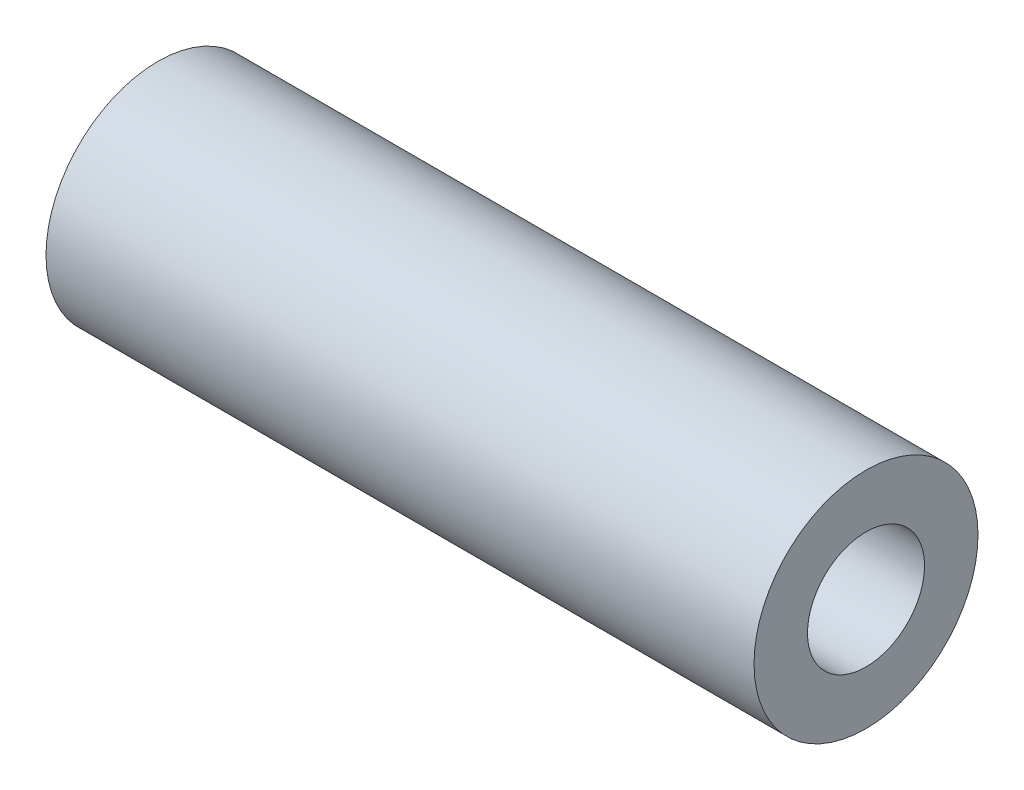
ISO-10303-21;
HEADER;
FILE_DESCRIPTION(('STEP AP214'),'2;1');
FILE_NAME('part.step','',(''),(''),'','','');
FILE_SCHEMA(('AUTOMOTIVE_DESIGN { 1 0 10303 214 1 1 1 1 }'));
ENDSEC;
DATA;
#1=APPLICATION_CONTEXT('core data for automotive mechanical design processes');
#2=APPLICATION_PROTOCOL_DEFINITION('international standard','automotive_design',2000,#1);
#3=PRODUCT_CONTEXT('',#1,'mechanical');
#4=PRODUCT('Part','Part','',(#3));
#5=PRODUCT_RELATED_PRODUCT_CATEGORY('part','',(#4));
#6=PRODUCT_DEFINITION_FORMATION('','',#4);
#7=PRODUCT_DEFINITION_CONTEXT('part definition',#1,'design');
#8=PRODUCT_DEFINITION('design','',#6,#7);
#9=PRODUCT_DEFINITION_SHAPE('','',#8);
#10=(LENGTH_UNIT() NAMED_UNIT(*) SI_UNIT(.MILLI.,.METRE.));
#11=(NAMED_UNIT(*) PLANE_ANGLE_UNIT() SI_UNIT($,.RADIAN.));
#12=(NAMED_UNIT(*) SI_UNIT($,.STERADIAN.) SOLID_ANGLE_UNIT());
#13=UNCERTAINTY_MEASURE_WITH_UNIT(LENGTH_MEASURE(1.E-05),#10,'distance_accuracy_value','');
#14=(GEOMETRIC_REPRESENTATION_CONTEXT(3) GLOBAL_UNCERTAINTY_ASSIGNED_CONTEXT((#13)) GLOBAL_UNIT_ASSIGNED_CONTEXT((#10,
#11,#12)) REPRESENTATION_CONTEXT('',''));
#15=CARTESIAN_POINT('',(0.,0.,0.));
#16=DIRECTION('',(0.,0.,1.));
#17=DIRECTION('',(1.,0.,0.));
#18=AXIS2_PLACEMENT_3D('',#15,#16,#17);
#19=CARTESIAN_POINT('',(15.05585,0.,0.));
#20=DIRECTION('',(1.,0.,0.));
#21=DIRECTION('',(0.,0.,-1.));
#22=AXIS2_PLACEMENT_3D('',#19,#20,#21);
#23=PLANE('',#22);
#24=CARTESIAN_POINT('',(15.05585,0.,0.));
#25=DIRECTION('',(1.,0.,0.));
#26=DIRECTION('',(0.,0.,-1.));
#27=AXIS2_PLACEMENT_3D('',#24,#25,#26);
#28=CIRCLE('',#27,4.7625);
#29=CARTESIAN_POINT('',(15.05585,0.,-4.7625));
#30=VERTEX_POINT('',#29);
#31=EDGE_CURVE('E10',#30,#30,#28,.T.);
#32=ORIENTED_EDGE('',*,*,#31,.T.);
#33=EDGE_LOOP('',(#32));
#34=FACE_BOUND('',#33,.T.);
#35=CARTESIAN_POINT('',(15.05585,0.,0.));
#36=DIRECTION('',(1.,0.,0.));
#37=DIRECTION('',(0.,0.,-1.));
#38=AXIS2_PLACEMENT_3D('',#35,#36,#37);
#39=CIRCLE('',#38,2.4892);
#40=CARTESIAN_POINT('',(15.05585,0.,-2.4892));
#41=VERTEX_POINT('',#40);
#42=EDGE_CURVE('E49',#41,#41,#39,.T.);
#43=ORIENTED_EDGE('',*,*,#42,.F.);
#44=EDGE_LOOP('',(#43));
#45=FACE_BOUND('',#44,.T.);
#46=ADVANCED_FACE('F38',(#34,#45),#23,.T.);
#47=CARTESIAN_POINT('',(-15.05585,0.,0.));
#48=DIRECTION('',(1.,0.,0.));
#49=DIRECTION('',(0.,0.,-1.));
#50=AXIS2_PLACEMENT_3D('',#47,#48,#49);
#51=PLANE('',#50);
#52=CARTESIAN_POINT('',(-15.05585,0.,0.));
#53=DIRECTION('',(1.,0.,0.));
#54=DIRECTION('',(0.,0.,-1.));
#55=AXIS2_PLACEMENT_3D('',#52,#53,#54);
#56=CIRCLE('',#55,4.7625);
#57=CARTESIAN_POINT('',(-15.05585,0.,-4.7625));
#58=VERTEX_POINT('',#57);
#59=EDGE_CURVE('E42',#58,#58,#56,.T.);
#60=ORIENTED_EDGE('',*,*,#59,.F.);
#61=EDGE_LOOP('',(#60));
#62=FACE_BOUND('',#61,.T.);
#63=CARTESIAN_POINT('',(-15.05585,0.,0.));
#64=DIRECTION('',(1.,0.,0.));
#65=DIRECTION('',(0.,0.,-1.));
#66=AXIS2_PLACEMENT_3D('',#63,#64,#65);
#67=CIRCLE('',#66,2.4892);
#68=CARTESIAN_POINT('',(-15.05585,0.,-2.4892));
#69=VERTEX_POINT('',#68);
#70=EDGE_CURVE('E51',#69,#69,#67,.T.);
#71=ORIENTED_EDGE('',*,*,#70,.T.);
#72=EDGE_LOOP('',(#71));
#73=FACE_BOUND('',#72,.T.);
#74=ADVANCED_FACE('F61',(#62,#73),#51,.F.);
#75=CARTESIAN_POINT('',(15.05585,0.,0.));
#76=DIRECTION('',(-1.,0.,0.));
#77=DIRECTION('',(0.,0.,1.));
#78=AXIS2_PLACEMENT_3D('',#75,#76,#77);
#79=CYLINDRICAL_SURFACE('',#78,4.7625);
#80=ORIENTED_EDGE('',*,*,#31,.F.);
#81=EDGE_LOOP('',(#80));
#82=FACE_BOUND('',#81,.T.);
#83=ORIENTED_EDGE('',*,*,#59,.T.);
#84=EDGE_LOOP('',(#83));
#85=FACE_BOUND('',#84,.T.);
#86=ADVANCED_FACE('F40',(#82,#85),#79,.T.);
#87=CARTESIAN_POINT('',(15.05585,0.,0.));
#88=DIRECTION('',(-1.,0.,0.));
#89=DIRECTION('',(0.,0.,1.));
#90=AXIS2_PLACEMENT_3D('',#87,#88,#89);
#91=CYLINDRICAL_SURFACE('',#90,2.4892);
#92=ORIENTED_EDGE('',*,*,#42,.T.);
#93=EDGE_LOOP('',(#92));
#94=FACE_BOUND('',#93,.T.);
#95=ORIENTED_EDGE('',*,*,#70,.F.);
#96=EDGE_LOOP('',(#95));
#97=FACE_BOUND('',#96,.T.);
#98=ADVANCED_FACE('F57',(#94,#97),#91,.F.);
#99=CLOSED_SHELL('',(#46,#74,#86,#98));
#100=MANIFOLD_SOLID_BREP('B2',#99);
#101=ADVANCED_BREP_SHAPE_REPRESENTATION('',(#18,#100),#14);
#102=SHAPE_DEFINITION_REPRESENTATION(#9,#101);
ENDSEC;
END-ISO-10303-21;
